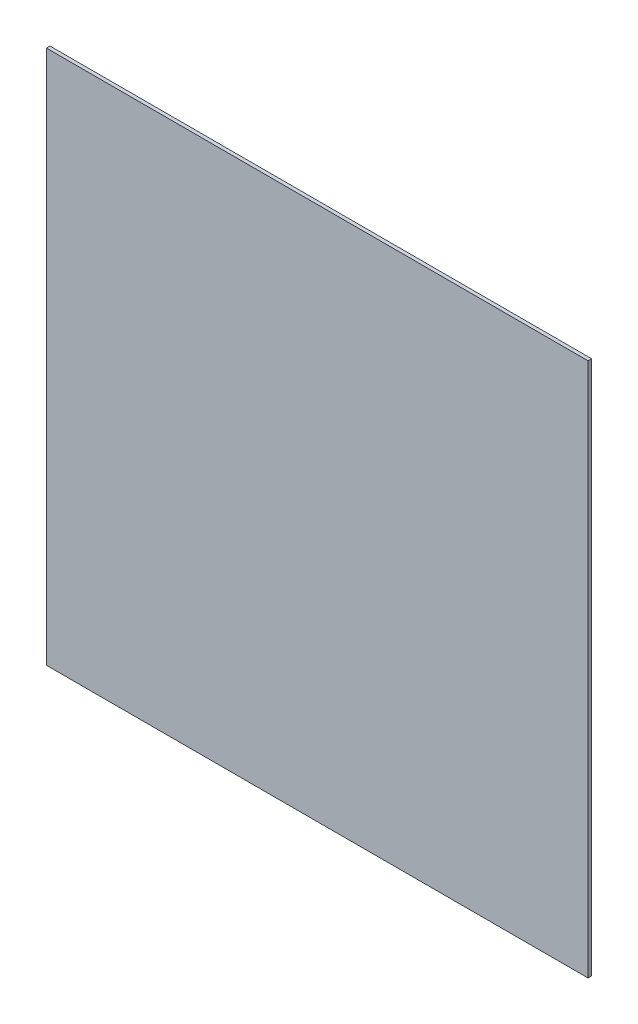
ISO-10303-21;
HEADER;
FILE_DESCRIPTION(('STEP AP214'),'2;1');
FILE_NAME('part.step','',(''),(''),'','','');
FILE_SCHEMA(('AUTOMOTIVE_DESIGN { 1 0 10303 214 1 1 1 1 }'));
ENDSEC;
DATA;
#1=APPLICATION_CONTEXT('core data for automotive mechanical design processes');
#2=APPLICATION_PROTOCOL_DEFINITION('international standard','automotive_design',2000,#1);
#3=PRODUCT_CONTEXT('',#1,'mechanical');
#4=PRODUCT('Part','Part','',(#3));
#5=PRODUCT_RELATED_PRODUCT_CATEGORY('part','',(#4));
#6=PRODUCT_DEFINITION_FORMATION('','',#4);
#7=PRODUCT_DEFINITION_CONTEXT('part definition',#1,'design');
#8=PRODUCT_DEFINITION('design','',#6,#7);
#9=PRODUCT_DEFINITION_SHAPE('','',#8);
#10=(LENGTH_UNIT() NAMED_UNIT(*) SI_UNIT(.MILLI.,.METRE.));
#11=(NAMED_UNIT(*) PLANE_ANGLE_UNIT() SI_UNIT($,.RADIAN.));
#12=(NAMED_UNIT(*) SI_UNIT($,.STERADIAN.) SOLID_ANGLE_UNIT());
#13=UNCERTAINTY_MEASURE_WITH_UNIT(LENGTH_MEASURE(1.E-05),#10,'distance_accuracy_value','');
#14=(GEOMETRIC_REPRESENTATION_CONTEXT(3) GLOBAL_UNCERTAINTY_ASSIGNED_CONTEXT((#13)) GLOBAL_UNIT_ASSIGNED_CONTEXT((#10,
#11,#12)) REPRESENTATION_CONTEXT('',''));
#15=CARTESIAN_POINT('',(0.,0.,0.));
#16=DIRECTION('',(0.,0.,1.));
#17=DIRECTION('',(1.,0.,0.));
#18=AXIS2_PLACEMENT_3D('',#15,#16,#17);
#19=CARTESIAN_POINT('',(0.,0.,10.));
#20=DIRECTION('',(1.,0.,0.));
#21=DIRECTION('',(0.,0.,-1.));
#22=AXIS2_PLACEMENT_3D('',#19,#20,#21);
#23=PLANE('',#22);
#24=DIRECTION('',(0.,-1.,0.));
#25=VECTOR('',#24,1.);
#26=CARTESIAN_POINT('',(0.,0.,0.));
#27=LINE('',#26,#25);
#28=CARTESIAN_POINT('',(0.,1500.,0.));
#29=VERTEX_POINT('',#28);
#30=CARTESIAN_POINT('',(0.,0.,0.));
#31=VERTEX_POINT('',#30);
#32=EDGE_CURVE('E96',#29,#31,#27,.T.);
#33=ORIENTED_EDGE('',*,*,#32,.T.);
#34=DIRECTION('',(0.,0.,-1.));
#35=VECTOR('',#34,1.);
#36=CARTESIAN_POINT('',(0.,0.,10.));
#37=LINE('',#36,#35);
#38=CARTESIAN_POINT('',(0.,0.,10.));
#39=VERTEX_POINT('',#38);
#40=EDGE_CURVE('E11',#39,#31,#37,.T.);
#41=ORIENTED_EDGE('',*,*,#40,.F.);
#42=DIRECTION('',(0.,-1.,0.));
#43=VECTOR('',#42,1.);
#44=CARTESIAN_POINT('',(0.,0.,10.));
#45=LINE('',#44,#43);
#46=CARTESIAN_POINT('',(0.,1500.,10.));
#47=VERTEX_POINT('',#46);
#48=EDGE_CURVE('E84',#47,#39,#45,.T.);
#49=ORIENTED_EDGE('',*,*,#48,.F.);
#50=DIRECTION('',(0.,0.,-1.));
#51=VECTOR('',#50,1.);
#52=CARTESIAN_POINT('',(0.,1500.,10.));
#53=LINE('',#52,#51);
#54=EDGE_CURVE('E92',#47,#29,#53,.T.);
#55=ORIENTED_EDGE('',*,*,#54,.T.);
#56=EDGE_LOOP('',(#33,#41,#49,#55));
#57=FACE_BOUND('',#56,.T.);
#58=ADVANCED_FACE('F33',(#57),#23,.F.);
#59=CARTESIAN_POINT('',(0.,0.,10.));
#60=DIRECTION('',(0.,1.,0.));
#61=DIRECTION('',(0.,0.,1.));
#62=AXIS2_PLACEMENT_3D('',#59,#60,#61);
#63=PLANE('',#62);
#64=DIRECTION('',(1.,0.,0.));
#65=VECTOR('',#64,1.);
#66=CARTESIAN_POINT('',(0.,0.,0.));
#67=LINE('',#66,#65);
#68=CARTESIAN_POINT('',(1520.,0.,0.));
#69=VERTEX_POINT('',#68);
#70=EDGE_CURVE('E88',#31,#69,#67,.T.);
#71=ORIENTED_EDGE('',*,*,#70,.T.);
#72=DIRECTION('',(0.,0.,-1.));
#73=VECTOR('',#72,1.);
#74=CARTESIAN_POINT('',(1520.,0.,10.));
#75=LINE('',#74,#73);
#76=CARTESIAN_POINT('',(1520.,0.,10.));
#77=VERTEX_POINT('',#76);
#78=EDGE_CURVE('E41',#77,#69,#75,.T.);
#79=ORIENTED_EDGE('',*,*,#78,.F.);
#80=DIRECTION('',(1.,0.,0.));
#81=VECTOR('',#80,1.);
#82=CARTESIAN_POINT('',(0.,0.,10.));
#83=LINE('',#82,#81);
#84=EDGE_CURVE('E79',#39,#77,#83,.T.);
#85=ORIENTED_EDGE('',*,*,#84,.F.);
#86=ORIENTED_EDGE('',*,*,#40,.T.);
#87=EDGE_LOOP('',(#71,#79,#85,#86));
#88=FACE_BOUND('',#87,.T.);
#89=ADVANCED_FACE('F87',(#88),#63,.F.);
#90=CARTESIAN_POINT('',(1520.,0.,10.));
#91=DIRECTION('',(-1.,0.,0.));
#92=DIRECTION('',(0.,0.,1.));
#93=AXIS2_PLACEMENT_3D('',#90,#91,#92);
#94=PLANE('',#93);
#95=DIRECTION('',(0.,1.,0.));
#96=VECTOR('',#95,1.);
#97=CARTESIAN_POINT('',(1520.,0.,0.));
#98=LINE('',#97,#96);
#99=CARTESIAN_POINT('',(1520.,1500.,0.));
#100=VERTEX_POINT('',#99);
#101=EDGE_CURVE('E66',#69,#100,#98,.T.);
#102=ORIENTED_EDGE('',*,*,#101,.T.);
#103=DIRECTION('',(0.,0.,-1.));
#104=VECTOR('',#103,1.);
#105=CARTESIAN_POINT('',(1520.,1500.,10.));
#106=LINE('',#105,#104);
#107=CARTESIAN_POINT('',(1520.,1500.,10.));
#108=VERTEX_POINT('',#107);
#109=EDGE_CURVE('E89',#108,#100,#106,.T.);
#110=ORIENTED_EDGE('',*,*,#109,.F.);
#111=DIRECTION('',(0.,1.,0.));
#112=VECTOR('',#111,1.);
#113=CARTESIAN_POINT('',(1520.,0.,10.));
#114=LINE('',#113,#112);
#115=EDGE_CURVE('E82',#77,#108,#114,.T.);
#116=ORIENTED_EDGE('',*,*,#115,.F.);
#117=ORIENTED_EDGE('',*,*,#78,.T.);
#118=EDGE_LOOP('',(#102,#110,#116,#117));
#119=FACE_BOUND('',#118,.T.);
#120=ADVANCED_FACE('F90',(#119),#94,.F.);
#121=CARTESIAN_POINT('',(0.,1500.,10.));
#122=DIRECTION('',(0.,-1.,0.));
#123=DIRECTION('',(0.,0.,-1.));
#124=AXIS2_PLACEMENT_3D('',#121,#122,#123);
#125=PLANE('',#124);
#126=DIRECTION('',(-1.,0.,0.));
#127=VECTOR('',#126,1.);
#128=CARTESIAN_POINT('',(0.,1500.,0.));
#129=LINE('',#128,#127);
#130=EDGE_CURVE('E72',#100,#29,#129,.T.);
#131=ORIENTED_EDGE('',*,*,#130,.T.);
#132=ORIENTED_EDGE('',*,*,#54,.F.);
#133=DIRECTION('',(-1.,0.,0.));
#134=VECTOR('',#133,1.);
#135=CARTESIAN_POINT('',(0.,1500.,10.));
#136=LINE('',#135,#134);
#137=EDGE_CURVE('E49',#108,#47,#136,.T.);
#138=ORIENTED_EDGE('',*,*,#137,.F.);
#139=ORIENTED_EDGE('',*,*,#109,.T.);
#140=EDGE_LOOP('',(#131,#132,#138,#139));
#141=FACE_BOUND('',#140,.T.);
#142=ADVANCED_FACE('F103',(#141),#125,.F.);
#143=CARTESIAN_POINT('',(0.,0.,10.));
#144=DIRECTION('',(0.,0.,-1.));
#145=DIRECTION('',(-1.,0.,0.));
#146=AXIS2_PLACEMENT_3D('',#143,#144,#145);
#147=PLANE('',#146);
#148=ORIENTED_EDGE('',*,*,#48,.T.);
#149=ORIENTED_EDGE('',*,*,#84,.T.);
#150=ORIENTED_EDGE('',*,*,#115,.T.);
#151=ORIENTED_EDGE('',*,*,#137,.T.);
#152=EDGE_LOOP('',(#148,#149,#150,#151));
#153=FACE_BOUND('',#152,.T.);
#154=ADVANCED_FACE('F80',(#153),#147,.F.);
#155=CARTESIAN_POINT('',(0.,0.,0.));
#156=DIRECTION('',(0.,0.,-1.));
#157=DIRECTION('',(-1.,0.,0.));
#158=AXIS2_PLACEMENT_3D('',#155,#156,#157);
#159=PLANE('',#158);
#160=ORIENTED_EDGE('',*,*,#32,.F.);
#161=ORIENTED_EDGE('',*,*,#130,.F.);
#162=ORIENTED_EDGE('',*,*,#101,.F.);
#163=ORIENTED_EDGE('',*,*,#70,.F.);
#164=EDGE_LOOP('',(#160,#161,#162,#163));
#165=FACE_BOUND('',#164,.T.);
#166=ADVANCED_FACE('F106',(#165),#159,.T.);
#167=CLOSED_SHELL('',(#58,#89,#120,#142,#154,#166));
#168=MANIFOLD_SOLID_BREP('B2',#167);
#169=ADVANCED_BREP_SHAPE_REPRESENTATION('',(#18,#168),#14);
#170=SHAPE_DEFINITION_REPRESENTATION(#9,#169);
ENDSEC;
END-ISO-10303-21;
